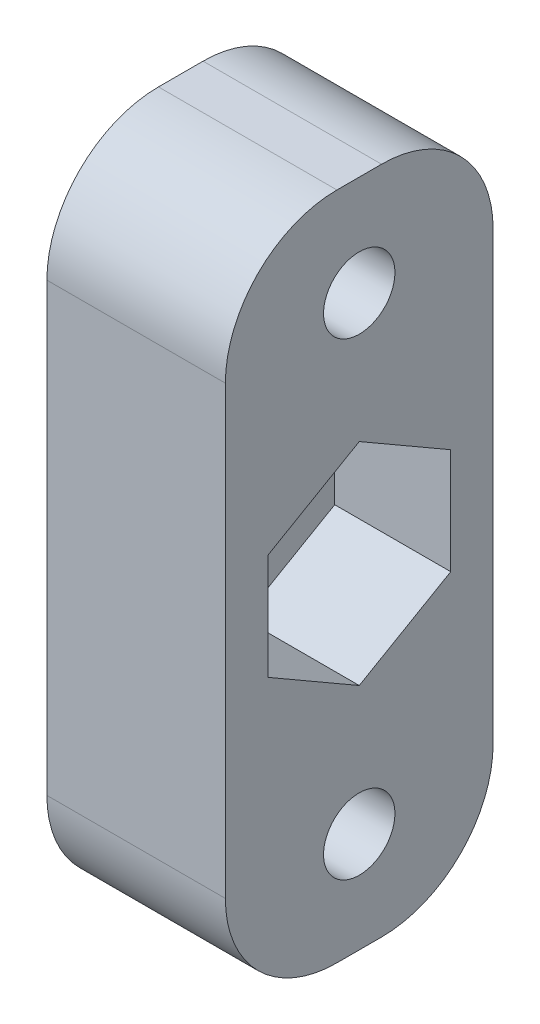
ISO-10303-21;
HEADER;
FILE_DESCRIPTION(('STEP AP214'),'2;1');
FILE_NAME('part.step','',(''),(''),'','','');
FILE_SCHEMA(('AUTOMOTIVE_DESIGN { 1 0 10303 214 1 1 1 1 }'));
ENDSEC;
DATA;
#1=APPLICATION_CONTEXT('core data for automotive mechanical design processes');
#2=APPLICATION_PROTOCOL_DEFINITION('international standard','automotive_design',2000,#1);
#3=PRODUCT_CONTEXT('',#1,'mechanical');
#4=PRODUCT('Part','Part','',(#3));
#5=PRODUCT_RELATED_PRODUCT_CATEGORY('part','',(#4));
#6=PRODUCT_DEFINITION_FORMATION('','',#4);
#7=PRODUCT_DEFINITION_CONTEXT('part definition',#1,'design');
#8=PRODUCT_DEFINITION('design','',#6,#7);
#9=PRODUCT_DEFINITION_SHAPE('','',#8);
#10=(LENGTH_UNIT() NAMED_UNIT(*) SI_UNIT(.MILLI.,.METRE.));
#11=(NAMED_UNIT(*) PLANE_ANGLE_UNIT() SI_UNIT($,.RADIAN.));
#12=(NAMED_UNIT(*) SI_UNIT($,.STERADIAN.) SOLID_ANGLE_UNIT());
#13=UNCERTAINTY_MEASURE_WITH_UNIT(LENGTH_MEASURE(1.E-05),#10,'distance_accuracy_value','');
#14=(GEOMETRIC_REPRESENTATION_CONTEXT(3) GLOBAL_UNCERTAINTY_ASSIGNED_CONTEXT((#13)) GLOBAL_UNIT_ASSIGNED_CONTEXT((#10,
#11,#12)) REPRESENTATION_CONTEXT('',''));
#15=CARTESIAN_POINT('',(0.,0.,0.));
#16=DIRECTION('',(0.,0.,1.));
#17=DIRECTION('',(1.,0.,0.));
#18=AXIS2_PLACEMENT_3D('',#15,#16,#17);
#19=CARTESIAN_POINT('',(-8.,-10.5,0.));
#20=DIRECTION('',(1.,0.,0.));
#21=DIRECTION('',(0.,0.,-1.));
#22=AXIS2_PLACEMENT_3D('',#19,#20,#21);
#23=CYLINDRICAL_SURFACE('',#22,1.6);
#24=CARTESIAN_POINT('',(0.,-10.5,0.));
#25=DIRECTION('',(1.,0.,0.));
#26=DIRECTION('',(0.,0.,-1.));
#27=AXIS2_PLACEMENT_3D('',#24,#25,#26);
#28=CIRCLE('',#27,1.6);
#29=CARTESIAN_POINT('',(0.,-10.5,-1.6));
#30=VERTEX_POINT('',#29);
#31=EDGE_CURVE('E270',#30,#30,#28,.T.);
#32=ORIENTED_EDGE('',*,*,#31,.T.);
#33=EDGE_LOOP('',(#32));
#34=FACE_BOUND('',#33,.T.);
#35=CARTESIAN_POINT('',(-2.8,-10.5,0.));
#36=DIRECTION('',(-1.,0.,0.));
#37=DIRECTION('',(0.,-1.,0.));
#38=AXIS2_PLACEMENT_3D('',#35,#36,#37);
#39=CIRCLE('',#38,1.6);
#40=CARTESIAN_POINT('',(-2.8,-12.1,0.));
#41=VERTEX_POINT('',#40);
#42=EDGE_CURVE('E258',#41,#41,#39,.F.);
#43=ORIENTED_EDGE('',*,*,#42,.F.);
#44=EDGE_LOOP('',(#43));
#45=FACE_BOUND('',#44,.T.);
#46=ADVANCED_FACE('F32',(#34,#45),#23,.F.);
#47=CARTESIAN_POINT('',(-7.99999999999999,15.,6.));
#48=DIRECTION('',(1.,0.,0.));
#49=DIRECTION('',(0.,1.,0.));
#50=AXIS2_PLACEMENT_3D('',#47,#48,#49);
#51=PLANE('',#50);
#52=DIRECTION('',(0.,0.5,0.866025403784439));
#53=VECTOR('',#52,1.);
#54=CARTESIAN_POINT('',(-8.,-3.99509618943233,16.9668238982516));
#55=LINE('',#54,#53);
#56=CARTESIAN_POINT('',(-8.,-13.7908965343809,0.));
#57=VERTEX_POINT('',#56);
#58=CARTESIAN_POINT('',(-8.,-12.1454482671904,2.85));
#59=VERTEX_POINT('',#58);
#60=EDGE_CURVE('E246',#57,#59,#55,.T.);
#61=ORIENTED_EDGE('',*,*,#60,.F.);
#62=DIRECTION('',(0.,-0.5,0.866025403784438));
#63=VECTOR('',#62,1.);
#64=CARTESIAN_POINT('',(-8.,-9.19124861213896,-7.9668238982516));
#65=LINE('',#64,#63);
#66=CARTESIAN_POINT('',(-8.,-12.1454482671904,-2.85));
#67=VERTEX_POINT('',#66);
#68=EDGE_CURVE('E213',#67,#57,#65,.T.);
#69=ORIENTED_EDGE('',*,*,#68,.F.);
#70=DIRECTION('',(0.,-1.,0.));
#71=VECTOR('',#70,1.);
#72=CARTESIAN_POINT('',(-7.99999999999999,15.,-2.85000000000001));
#73=LINE('',#72,#71);
#74=CARTESIAN_POINT('',(-8.,-8.85455173280957,-2.85));
#75=VERTEX_POINT('',#74);
#76=EDGE_CURVE('E232',#75,#67,#73,.T.);
#77=ORIENTED_EDGE('',*,*,#76,.F.);
#78=DIRECTION('',(0.,-0.5,-0.866025403784438));
#79=VECTOR('',#78,1.);
#80=CARTESIAN_POINT('',(-7.99999999999999,0.941248612138975,14.1168238982516));
#81=LINE('',#80,#79);
#82=CARTESIAN_POINT('',(-7.99999999999999,-7.20910346561913,0.));
#83=VERTEX_POINT('',#82);
#84=EDGE_CURVE('E235',#83,#75,#81,.T.);
#85=ORIENTED_EDGE('',*,*,#84,.F.);
#86=DIRECTION('',(0.,0.5,-0.866025403784439));
#87=VECTOR('',#86,1.);
#88=CARTESIAN_POINT('',(-8.,-4.25490381056767,-5.1168238982516));
#89=LINE('',#88,#87);
#90=CARTESIAN_POINT('',(-8.,-8.85455173280957,2.85));
#91=VERTEX_POINT('',#90);
#92=EDGE_CURVE('E251',#91,#83,#89,.T.);
#93=ORIENTED_EDGE('',*,*,#92,.F.);
#94=DIRECTION('',(0.,1.,0.));
#95=VECTOR('',#94,1.);
#96=CARTESIAN_POINT('',(-7.99999999999999,15.,2.85));
#97=LINE('',#96,#95);
#98=EDGE_CURVE('E248',#59,#91,#97,.T.);
#99=ORIENTED_EDGE('',*,*,#98,.F.);
#100=EDGE_LOOP('',(#61,#69,#77,#85,#93,#99));
#101=FACE_BOUND('',#100,.T.);
#102=CARTESIAN_POINT('',(-8.,0.,0.));
#103=DIRECTION('',(1.,0.,0.));
#104=DIRECTION('',(0.,0.,-1.));
#105=AXIS2_PLACEMENT_3D('',#102,#103,#104);
#106=CIRCLE('',#105,2.6);
#107=CARTESIAN_POINT('',(-8.,0.,-2.6));
#108=VERTEX_POINT('',#107);
#109=EDGE_CURVE('E266',#108,#108,#106,.T.);
#110=ORIENTED_EDGE('',*,*,#109,.T.);
#111=EDGE_LOOP('',(#110));
#112=FACE_BOUND('',#111,.T.);
#113=DIRECTION('',(0.,-1.,0.));
#114=VECTOR('',#113,1.);
#115=CARTESIAN_POINT('',(-7.99999999999999,15.,6.));
#116=LINE('',#115,#114);
#117=CARTESIAN_POINT('',(-7.99999999999999,10.,6.));
#118=VERTEX_POINT('',#117);
#119=CARTESIAN_POINT('',(-8.,-10.,6.));
#120=VERTEX_POINT('',#119);
#121=EDGE_CURVE('E374',#118,#120,#116,.T.);
#122=ORIENTED_EDGE('',*,*,#121,.F.);
#123=CARTESIAN_POINT('',(-7.99999999999999,10.,1.));
#124=DIRECTION('',(1.,0.,0.));
#125=DIRECTION('',(0.,1.,0.));
#126=AXIS2_PLACEMENT_3D('',#123,#124,#125);
#127=CIRCLE('',#126,5.);
#128=CARTESIAN_POINT('',(-7.99999999999999,15.,1.));
#129=VERTEX_POINT('',#128);
#130=EDGE_CURVE('E411',#118,#129,#127,.F.);
#131=ORIENTED_EDGE('',*,*,#130,.T.);
#132=DIRECTION('',(0.,0.,-1.));
#133=VECTOR('',#132,1.);
#134=CARTESIAN_POINT('',(-7.99999999999999,15.,6.));
#135=LINE('',#134,#133);
#136=CARTESIAN_POINT('',(-7.99999999999999,15.,-1.));
#137=VERTEX_POINT('',#136);
#138=EDGE_CURVE('E387',#129,#137,#135,.T.);
#139=ORIENTED_EDGE('',*,*,#138,.T.);
#140=CARTESIAN_POINT('',(-7.99999999999999,10.,-1.));
#141=DIRECTION('',(1.,0.,0.));
#142=DIRECTION('',(0.,1.,0.));
#143=AXIS2_PLACEMENT_3D('',#140,#141,#142);
#144=CIRCLE('',#143,5.);
#145=CARTESIAN_POINT('',(-7.99999999999999,10.,-6.));
#146=VERTEX_POINT('',#145);
#147=EDGE_CURVE('E409',#137,#146,#144,.F.);
#148=ORIENTED_EDGE('',*,*,#147,.T.);
#149=DIRECTION('',(0.,-1.,0.));
#150=VECTOR('',#149,1.);
#151=CARTESIAN_POINT('',(-7.99999999999999,15.,-6.));
#152=LINE('',#151,#150);
#153=CARTESIAN_POINT('',(-8.,-10.,-6.));
#154=VERTEX_POINT('',#153);
#155=EDGE_CURVE('E375',#146,#154,#152,.T.);
#156=ORIENTED_EDGE('',*,*,#155,.T.);
#157=CARTESIAN_POINT('',(-8.,-10.,-1.));
#158=DIRECTION('',(1.,0.,0.));
#159=DIRECTION('',(0.,1.,0.));
#160=AXIS2_PLACEMENT_3D('',#157,#158,#159);
#161=CIRCLE('',#160,5.);
#162=CARTESIAN_POINT('',(-8.,-15.,-1.));
#163=VERTEX_POINT('',#162);
#164=EDGE_CURVE('E405',#154,#163,#161,.F.);
#165=ORIENTED_EDGE('',*,*,#164,.T.);
#166=DIRECTION('',(0.,0.,-1.));
#167=VECTOR('',#166,1.);
#168=CARTESIAN_POINT('',(-8.,-15.,6.));
#169=LINE('',#168,#167);
#170=CARTESIAN_POINT('',(-8.,-15.,1.));
#171=VERTEX_POINT('',#170);
#172=EDGE_CURVE('E384',#171,#163,#169,.T.);
#173=ORIENTED_EDGE('',*,*,#172,.F.);
#174=CARTESIAN_POINT('',(-8.,-10.,1.));
#175=DIRECTION('',(1.,0.,0.));
#176=DIRECTION('',(0.,1.,0.));
#177=AXIS2_PLACEMENT_3D('',#174,#175,#176);
#178=CIRCLE('',#177,5.);
#179=EDGE_CURVE('E407',#171,#120,#178,.F.);
#180=ORIENTED_EDGE('',*,*,#179,.T.);
#181=EDGE_LOOP('',(#122,#131,#139,#148,#156,#165,#173,#180));
#182=FACE_BOUND('',#181,.T.);
#183=DIRECTION('',(0.,0.5,-0.866025403784438));
#184=VECTOR('',#183,1.);
#185=CARTESIAN_POINT('',(-7.99999999999999,6.55875138786103,1.12644284148501));
#186=LINE('',#185,#184);
#187=CARTESIAN_POINT('',(-7.99999999999999,7.20910346561913,0.));
#188=VERTEX_POINT('',#187);
#189=CARTESIAN_POINT('',(-7.99999999999999,8.85455173280956,-2.85));
#190=VERTEX_POINT('',#189);
#191=EDGE_CURVE('E292',#188,#190,#186,.T.);
#192=ORIENTED_EDGE('',*,*,#191,.T.);
#193=DIRECTION('',(0.,1.,0.));
#194=VECTOR('',#193,1.);
#195=CARTESIAN_POINT('',(-7.99999999999999,15.,-2.85));
#196=LINE('',#195,#194);
#197=CARTESIAN_POINT('',(-7.99999999999999,12.1454482671904,-2.85));
#198=VERTEX_POINT('',#197);
#199=EDGE_CURVE('E295',#190,#198,#196,.T.);
#200=ORIENTED_EDGE('',*,*,#199,.T.);
#201=DIRECTION('',(0.,0.5,0.866025403784438));
#202=VECTOR('',#201,1.);
#203=CARTESIAN_POINT('',(-7.99999999999999,16.691248612139,5.02355715851498));
#204=LINE('',#203,#202);
#205=CARTESIAN_POINT('',(-7.99999999999999,13.7908965343809,0.));
#206=VERTEX_POINT('',#205);
#207=EDGE_CURVE('E298',#198,#206,#204,.T.);
#208=ORIENTED_EDGE('',*,*,#207,.T.);
#209=DIRECTION('',(0.,-0.5,0.866025403784439));
#210=VECTOR('',#209,1.);
#211=CARTESIAN_POINT('',(-7.99999999999999,11.4950961894323,3.97644284148501));
#212=LINE('',#211,#210);
#213=CARTESIAN_POINT('',(-7.99999999999999,12.1454482671904,2.85));
#214=VERTEX_POINT('',#213);
#215=EDGE_CURVE('E301',#206,#214,#212,.T.);
#216=ORIENTED_EDGE('',*,*,#215,.T.);
#217=DIRECTION('',(0.,-1.,0.));
#218=VECTOR('',#217,1.);
#219=CARTESIAN_POINT('',(-7.99999999999999,15.,2.85));
#220=LINE('',#219,#218);
#221=CARTESIAN_POINT('',(-7.99999999999999,8.85455173280957,2.85));
#222=VERTEX_POINT('',#221);
#223=EDGE_CURVE('E304',#214,#222,#220,.T.);
#224=ORIENTED_EDGE('',*,*,#223,.T.);
#225=DIRECTION('',(0.,-0.5,-0.866025403784439));
#226=VECTOR('',#225,1.);
#227=CARTESIAN_POINT('',(-7.99999999999999,11.7549038105677,7.87355715851499));
#228=LINE('',#227,#226);
#229=EDGE_CURVE('E281',#222,#188,#228,.T.);
#230=ORIENTED_EDGE('',*,*,#229,.T.);
#231=EDGE_LOOP('',(#192,#200,#208,#216,#224,#230));
#232=FACE_BOUND('',#231,.T.);
#233=ADVANCED_FACE('F442',(#101,#112,#182,#232),#51,.F.);
#234=CARTESIAN_POINT('',(0.,15.,6.));
#235=DIRECTION('',(-1.,0.,0.));
#236=DIRECTION('',(0.,0.,1.));
#237=AXIS2_PLACEMENT_3D('',#234,#235,#236);
#238=PLANE('',#237);
#239=ORIENTED_EDGE('',*,*,#31,.F.);
#240=EDGE_LOOP('',(#239));
#241=FACE_BOUND('',#240,.T.);
#242=CARTESIAN_POINT('',(0.,10.5,0.));
#243=DIRECTION('',(1.,0.,0.));
#244=DIRECTION('',(0.,0.,-1.));
#245=AXIS2_PLACEMENT_3D('',#242,#243,#244);
#246=CIRCLE('',#245,1.6);
#247=CARTESIAN_POINT('',(0.,10.5,-1.6));
#248=VERTEX_POINT('',#247);
#249=EDGE_CURVE('E273',#248,#248,#246,.T.);
#250=ORIENTED_EDGE('',*,*,#249,.F.);
#251=EDGE_LOOP('',(#250));
#252=FACE_BOUND('',#251,.T.);
#253=DIRECTION('',(0.,-0.5,0.866025403784439));
#254=VECTOR('',#253,1.);
#255=CARTESIAN_POINT('',(0.,4.73427220735493,0.));
#256=LINE('',#255,#254);
#257=CARTESIAN_POINT('',(0.,4.73427220735493,0.));
#258=VERTEX_POINT('',#257);
#259=CARTESIAN_POINT('',(0.,2.36713610367747,4.1));
#260=VERTEX_POINT('',#259);
#261=EDGE_CURVE('E344',#258,#260,#256,.T.);
#262=ORIENTED_EDGE('',*,*,#261,.F.);
#263=DIRECTION('',(0.,0.5,0.866025403784439));
#264=VECTOR('',#263,1.);
#265=CARTESIAN_POINT('',(0.,2.36713610367747,-4.1));
#266=LINE('',#265,#264);
#267=CARTESIAN_POINT('',(0.,2.36713610367747,-4.1));
#268=VERTEX_POINT('',#267);
#269=EDGE_CURVE('E322',#268,#258,#266,.T.);
#270=ORIENTED_EDGE('',*,*,#269,.F.);
#271=DIRECTION('',(0.,1.,0.));
#272=VECTOR('',#271,1.);
#273=CARTESIAN_POINT('',(0.,-2.36713610367747,-4.1));
#274=LINE('',#273,#272);
#275=CARTESIAN_POINT('',(0.,-2.36713610367747,-4.1));
#276=VERTEX_POINT('',#275);
#277=EDGE_CURVE('E327',#276,#268,#274,.T.);
#278=ORIENTED_EDGE('',*,*,#277,.F.);
#279=DIRECTION('',(0.,0.5,-0.866025403784439));
#280=VECTOR('',#279,1.);
#281=CARTESIAN_POINT('',(0.,-4.73427220735493,0.));
#282=LINE('',#281,#280);
#283=CARTESIAN_POINT('',(0.,-4.73427220735493,0.));
#284=VERTEX_POINT('',#283);
#285=EDGE_CURVE('E353',#284,#276,#282,.T.);
#286=ORIENTED_EDGE('',*,*,#285,.F.);
#287=DIRECTION('',(0.,-0.5,-0.866025403784439));
#288=VECTOR('',#287,1.);
#289=CARTESIAN_POINT('',(0.,-2.36713610367747,4.1));
#290=LINE('',#289,#288);
#291=CARTESIAN_POINT('',(0.,-2.36713610367747,4.1));
#292=VERTEX_POINT('',#291);
#293=EDGE_CURVE('E350',#292,#284,#290,.T.);
#294=ORIENTED_EDGE('',*,*,#293,.F.);
#295=DIRECTION('',(0.,-1.,0.));
#296=VECTOR('',#295,1.);
#297=CARTESIAN_POINT('',(0.,2.36713610367747,4.1));
#298=LINE('',#297,#296);
#299=EDGE_CURVE('E347',#260,#292,#298,.T.);
#300=ORIENTED_EDGE('',*,*,#299,.F.);
#301=EDGE_LOOP('',(#262,#270,#278,#286,#294,#300));
#302=FACE_BOUND('',#301,.T.);
#303=DIRECTION('',(0.,0.,-1.));
#304=VECTOR('',#303,1.);
#305=CARTESIAN_POINT('',(0.,15.,6.));
#306=LINE('',#305,#304);
#307=CARTESIAN_POINT('',(0.,15.,1.));
#308=VERTEX_POINT('',#307);
#309=CARTESIAN_POINT('',(0.,15.,-1.));
#310=VERTEX_POINT('',#309);
#311=EDGE_CURVE('E390',#308,#310,#306,.T.);
#312=ORIENTED_EDGE('',*,*,#311,.F.);
#313=CARTESIAN_POINT('',(0.,10.,1.));
#314=DIRECTION('',(-1.,0.,0.));
#315=DIRECTION('',(0.,0.,1.));
#316=AXIS2_PLACEMENT_3D('',#313,#314,#315);
#317=CIRCLE('',#316,5.);
#318=CARTESIAN_POINT('',(0.,10.,6.));
#319=VERTEX_POINT('',#318);
#320=EDGE_CURVE('E422',#308,#319,#317,.F.);
#321=ORIENTED_EDGE('',*,*,#320,.T.);
#322=DIRECTION('',(0.,1.,0.));
#323=VECTOR('',#322,1.);
#324=CARTESIAN_POINT('',(0.,15.,6.));
#325=LINE('',#324,#323);
#326=CARTESIAN_POINT('',(0.,-10.,6.));
#327=VERTEX_POINT('',#326);
#328=EDGE_CURVE('E371',#327,#319,#325,.T.);
#329=ORIENTED_EDGE('',*,*,#328,.F.);
#330=CARTESIAN_POINT('',(0.,-10.,1.));
#331=DIRECTION('',(-1.,0.,0.));
#332=DIRECTION('',(0.,0.,1.));
#333=AXIS2_PLACEMENT_3D('',#330,#331,#332);
#334=CIRCLE('',#333,5.);
#335=CARTESIAN_POINT('',(0.,-15.,1.));
#336=VERTEX_POINT('',#335);
#337=EDGE_CURVE('E55',#327,#336,#334,.F.);
#338=ORIENTED_EDGE('',*,*,#337,.T.);
#339=DIRECTION('',(0.,0.,-1.));
#340=VECTOR('',#339,1.);
#341=CARTESIAN_POINT('',(0.,-15.,6.));
#342=LINE('',#341,#340);
#343=CARTESIAN_POINT('',(0.,-15.,-1.));
#344=VERTEX_POINT('',#343);
#345=EDGE_CURVE('E378',#336,#344,#342,.T.);
#346=ORIENTED_EDGE('',*,*,#345,.T.);
#347=CARTESIAN_POINT('',(0.,-10.,-1.));
#348=DIRECTION('',(-1.,0.,0.));
#349=DIRECTION('',(0.,0.,1.));
#350=AXIS2_PLACEMENT_3D('',#347,#348,#349);
#351=CIRCLE('',#350,5.);
#352=CARTESIAN_POINT('',(0.,-10.,-6.));
#353=VERTEX_POINT('',#352);
#354=EDGE_CURVE('E47',#344,#353,#351,.F.);
#355=ORIENTED_EDGE('',*,*,#354,.T.);
#356=DIRECTION('',(0.,1.,0.));
#357=VECTOR('',#356,1.);
#358=CARTESIAN_POINT('',(0.,15.,-6.));
#359=LINE('',#358,#357);
#360=CARTESIAN_POINT('',(0.,10.,-6.));
#361=VERTEX_POINT('',#360);
#362=EDGE_CURVE('E360',#353,#361,#359,.T.);
#363=ORIENTED_EDGE('',*,*,#362,.T.);
#364=CARTESIAN_POINT('',(0.,10.,-1.));
#365=DIRECTION('',(-1.,0.,0.));
#366=DIRECTION('',(0.,0.,1.));
#367=AXIS2_PLACEMENT_3D('',#364,#365,#366);
#368=CIRCLE('',#367,5.);
#369=EDGE_CURVE('E420',#361,#310,#368,.F.);
#370=ORIENTED_EDGE('',*,*,#369,.T.);
#371=EDGE_LOOP('',(#312,#321,#329,#338,#346,#355,#363,#370));
#372=FACE_BOUND('',#371,.T.);
#373=ADVANCED_FACE('F433',(#241,#252,#302,#372),#238,.F.);
#374=CARTESIAN_POINT('',(-7.99999999999999,15.,6.));
#375=DIRECTION('',(0.,-1.,0.));
#376=DIRECTION('',(0.,0.,-1.));
#377=AXIS2_PLACEMENT_3D('',#374,#375,#376);
#378=PLANE('',#377);
#379=ORIENTED_EDGE('',*,*,#138,.F.);
#380=DIRECTION('',(-1.,0.,0.));
#381=VECTOR('',#380,1.);
#382=CARTESIAN_POINT('',(0.,15.,1.));
#383=LINE('',#382,#381);
#384=EDGE_CURVE('E416',#129,#308,#383,.F.);
#385=ORIENTED_EDGE('',*,*,#384,.T.);
#386=ORIENTED_EDGE('',*,*,#311,.T.);
#387=DIRECTION('',(-1.,0.,0.));
#388=VECTOR('',#387,1.);
#389=CARTESIAN_POINT('',(-7.99999999999999,15.,-1.));
#390=LINE('',#389,#388);
#391=EDGE_CURVE('E413',#310,#137,#390,.T.);
#392=ORIENTED_EDGE('',*,*,#391,.T.);
#393=EDGE_LOOP('',(#379,#385,#386,#392));
#394=FACE_BOUND('',#393,.T.);
#395=ADVANCED_FACE('F451',(#394),#378,.F.);
#396=CARTESIAN_POINT('',(-8.,-15.,6.));
#397=DIRECTION('',(0.,1.,0.));
#398=DIRECTION('',(0.,0.,1.));
#399=AXIS2_PLACEMENT_3D('',#396,#397,#398);
#400=PLANE('',#399);
#401=ORIENTED_EDGE('',*,*,#345,.F.);
#402=DIRECTION('',(1.,0.,0.));
#403=VECTOR('',#402,1.);
#404=CARTESIAN_POINT('',(-8.,-15.,1.));
#405=LINE('',#404,#403);
#406=EDGE_CURVE('E11',#336,#171,#405,.F.);
#407=ORIENTED_EDGE('',*,*,#406,.T.);
#408=ORIENTED_EDGE('',*,*,#172,.T.);
#409=DIRECTION('',(1.,0.,0.));
#410=VECTOR('',#409,1.);
#411=CARTESIAN_POINT('',(-8.,-15.,-1.));
#412=LINE('',#411,#410);
#413=EDGE_CURVE('E40',#163,#344,#412,.T.);
#414=ORIENTED_EDGE('',*,*,#413,.T.);
#415=EDGE_LOOP('',(#401,#407,#408,#414));
#416=FACE_BOUND('',#415,.T.);
#417=ADVANCED_FACE('F428',(#416),#400,.F.);
#418=CARTESIAN_POINT('',(0.,-15.,6.));
#419=DIRECTION('',(0.,0.,1.));
#420=DIRECTION('',(1.,0.,0.));
#421=AXIS2_PLACEMENT_3D('',#418,#419,#420);
#422=PLANE('',#421);
#423=ORIENTED_EDGE('',*,*,#328,.T.);
#424=DIRECTION('',(-1.,0.,0.));
#425=VECTOR('',#424,1.);
#426=CARTESIAN_POINT('',(-7.99999999999999,10.,6.));
#427=LINE('',#426,#425);
#428=EDGE_CURVE('E402',#319,#118,#427,.T.);
#429=ORIENTED_EDGE('',*,*,#428,.T.);
#430=ORIENTED_EDGE('',*,*,#121,.T.);
#431=DIRECTION('',(1.,0.,0.));
#432=VECTOR('',#431,1.);
#433=CARTESIAN_POINT('',(0.,-10.,6.));
#434=LINE('',#433,#432);
#435=EDGE_CURVE('E393',#120,#327,#434,.T.);
#436=ORIENTED_EDGE('',*,*,#435,.T.);
#437=EDGE_LOOP('',(#423,#429,#430,#436));
#438=FACE_BOUND('',#437,.T.);
#439=ADVANCED_FACE('F457',(#438),#422,.T.);
#440=CARTESIAN_POINT('',(0.,-15.,-6.));
#441=DIRECTION('',(0.,0.,1.));
#442=DIRECTION('',(1.,0.,0.));
#443=AXIS2_PLACEMENT_3D('',#440,#441,#442);
#444=PLANE('',#443);
#445=ORIENTED_EDGE('',*,*,#155,.F.);
#446=DIRECTION('',(-1.,0.,0.));
#447=VECTOR('',#446,1.);
#448=CARTESIAN_POINT('',(0.,10.,-6.));
#449=LINE('',#448,#447);
#450=EDGE_CURVE('E426',#146,#361,#449,.F.);
#451=ORIENTED_EDGE('',*,*,#450,.T.);
#452=ORIENTED_EDGE('',*,*,#362,.F.);
#453=DIRECTION('',(1.,0.,0.));
#454=VECTOR('',#453,1.);
#455=CARTESIAN_POINT('',(0.,-10.,-6.));
#456=LINE('',#455,#454);
#457=EDGE_CURVE('E424',#353,#154,#456,.F.);
#458=ORIENTED_EDGE('',*,*,#457,.T.);
#459=EDGE_LOOP('',(#445,#451,#452,#458));
#460=FACE_BOUND('',#459,.T.);
#461=ADVANCED_FACE('F438',(#460),#444,.F.);
#462=CARTESIAN_POINT('',(-5.2,2.36713610367747,-4.1));
#463=DIRECTION('',(0.,0.866025403784439,-0.5));
#464=DIRECTION('',(0.,0.5,0.866025403784439));
#465=AXIS2_PLACEMENT_3D('',#462,#463,#464);
#466=PLANE('',#465);
#467=ORIENTED_EDGE('',*,*,#269,.T.);
#468=DIRECTION('',(1.,0.,0.));
#469=VECTOR('',#468,1.);
#470=CARTESIAN_POINT('',(-5.2,4.73427220735493,0.));
#471=LINE('',#470,#469);
#472=CARTESIAN_POINT('',(-5.2,4.73427220735493,0.));
#473=VERTEX_POINT('',#472);
#474=EDGE_CURVE('E342',#473,#258,#471,.T.);
#475=ORIENTED_EDGE('',*,*,#474,.F.);
#476=DIRECTION('',(0.,0.5,0.866025403784439));
#477=VECTOR('',#476,1.);
#478=CARTESIAN_POINT('',(-5.2,2.36713610367747,-4.1));
#479=LINE('',#478,#477);
#480=CARTESIAN_POINT('',(-5.2,2.36713610367747,-4.1));
#481=VERTEX_POINT('',#480);
#482=EDGE_CURVE('E323',#481,#473,#479,.T.);
#483=ORIENTED_EDGE('',*,*,#482,.F.);
#484=DIRECTION('',(1.,0.,0.));
#485=VECTOR('',#484,1.);
#486=CARTESIAN_POINT('',(-5.2,2.36713610367747,-4.1));
#487=LINE('',#486,#485);
#488=EDGE_CURVE('E358',#481,#268,#487,.T.);
#489=ORIENTED_EDGE('',*,*,#488,.T.);
#490=EDGE_LOOP('',(#467,#475,#483,#489));
#491=FACE_BOUND('',#490,.T.);
#492=ADVANCED_FACE('F521',(#491),#466,.F.);
#493=CARTESIAN_POINT('',(-5.2,-2.36713610367747,-4.1));
#494=DIRECTION('',(0.,0.,-1.));
#495=DIRECTION('',(-1.,0.,0.));
#496=AXIS2_PLACEMENT_3D('',#493,#494,#495);
#497=PLANE('',#496);
#498=ORIENTED_EDGE('',*,*,#277,.T.);
#499=ORIENTED_EDGE('',*,*,#488,.F.);
#500=DIRECTION('',(0.,1.,0.));
#501=VECTOR('',#500,1.);
#502=CARTESIAN_POINT('',(-5.2,-2.36713610367747,-4.1));
#503=LINE('',#502,#501);
#504=CARTESIAN_POINT('',(-5.2,-2.36713610367747,-4.1));
#505=VERTEX_POINT('',#504);
#506=EDGE_CURVE('E339',#505,#481,#503,.T.);
#507=ORIENTED_EDGE('',*,*,#506,.F.);
#508=DIRECTION('',(1.,0.,0.));
#509=VECTOR('',#508,1.);
#510=CARTESIAN_POINT('',(-5.2,-2.36713610367747,-4.1));
#511=LINE('',#510,#509);
#512=EDGE_CURVE('E361',#505,#276,#511,.T.);
#513=ORIENTED_EDGE('',*,*,#512,.T.);
#514=EDGE_LOOP('',(#498,#499,#507,#513));
#515=FACE_BOUND('',#514,.T.);
#516=ADVANCED_FACE('F517',(#515),#497,.F.);
#517=CARTESIAN_POINT('',(-5.2,-4.73427220735493,0.));
#518=DIRECTION('',(0.,-0.866025403784439,-0.5));
#519=DIRECTION('',(0.,0.5,-0.866025403784439));
#520=AXIS2_PLACEMENT_3D('',#517,#518,#519);
#521=PLANE('',#520);
#522=ORIENTED_EDGE('',*,*,#285,.T.);
#523=ORIENTED_EDGE('',*,*,#512,.F.);
#524=DIRECTION('',(0.,0.5,-0.866025403784439));
#525=VECTOR('',#524,1.);
#526=CARTESIAN_POINT('',(-5.2,-4.73427220735493,0.));
#527=LINE('',#526,#525);
#528=CARTESIAN_POINT('',(-5.2,-4.73427220735493,0.));
#529=VERTEX_POINT('',#528);
#530=EDGE_CURVE('E336',#529,#505,#527,.T.);
#531=ORIENTED_EDGE('',*,*,#530,.F.);
#532=DIRECTION('',(1.,0.,0.));
#533=VECTOR('',#532,1.);
#534=CARTESIAN_POINT('',(-5.2,-4.73427220735493,0.));
#535=LINE('',#534,#533);
#536=EDGE_CURVE('E363',#529,#284,#535,.T.);
#537=ORIENTED_EDGE('',*,*,#536,.T.);
#538=EDGE_LOOP('',(#522,#523,#531,#537));
#539=FACE_BOUND('',#538,.T.);
#540=ADVANCED_FACE('F520',(#539),#521,.F.);
#541=CARTESIAN_POINT('',(-5.2,-2.36713610367747,4.1));
#542=DIRECTION('',(0.,-0.866025403784439,0.5));
#543=DIRECTION('',(0.,-0.5,-0.866025403784439));
#544=AXIS2_PLACEMENT_3D('',#541,#542,#543);
#545=PLANE('',#544);
#546=ORIENTED_EDGE('',*,*,#293,.T.);
#547=ORIENTED_EDGE('',*,*,#536,.F.);
#548=DIRECTION('',(0.,-0.5,-0.866025403784439));
#549=VECTOR('',#548,1.);
#550=CARTESIAN_POINT('',(-5.2,-2.36713610367747,4.1));
#551=LINE('',#550,#549);
#552=CARTESIAN_POINT('',(-5.2,-2.36713610367747,4.1));
#553=VERTEX_POINT('',#552);
#554=EDGE_CURVE('E333',#553,#529,#551,.T.);
#555=ORIENTED_EDGE('',*,*,#554,.F.);
#556=DIRECTION('',(1.,0.,0.));
#557=VECTOR('',#556,1.);
#558=CARTESIAN_POINT('',(-5.2,-2.36713610367747,4.1));
#559=LINE('',#558,#557);
#560=EDGE_CURVE('E365',#553,#292,#559,.T.);
#561=ORIENTED_EDGE('',*,*,#560,.T.);
#562=EDGE_LOOP('',(#546,#547,#555,#561));
#563=FACE_BOUND('',#562,.T.);
#564=ADVANCED_FACE('F525',(#563),#545,.F.);
#565=CARTESIAN_POINT('',(-5.2,2.36713610367747,4.1));
#566=DIRECTION('',(0.,0.,1.));
#567=DIRECTION('',(0.,-1.,0.));
#568=AXIS2_PLACEMENT_3D('',#565,#566,#567);
#569=PLANE('',#568);
#570=ORIENTED_EDGE('',*,*,#299,.T.);
#571=ORIENTED_EDGE('',*,*,#560,.F.);
#572=DIRECTION('',(0.,-1.,0.));
#573=VECTOR('',#572,1.);
#574=CARTESIAN_POINT('',(-5.2,2.36713610367747,4.1));
#575=LINE('',#574,#573);
#576=CARTESIAN_POINT('',(-5.2,2.36713610367747,4.1));
#577=VERTEX_POINT('',#576);
#578=EDGE_CURVE('E330',#577,#553,#575,.T.);
#579=ORIENTED_EDGE('',*,*,#578,.F.);
#580=DIRECTION('',(1.,0.,0.));
#581=VECTOR('',#580,1.);
#582=CARTESIAN_POINT('',(-5.2,2.36713610367747,4.1));
#583=LINE('',#582,#581);
#584=EDGE_CURVE('E367',#577,#260,#583,.T.);
#585=ORIENTED_EDGE('',*,*,#584,.T.);
#586=EDGE_LOOP('',(#570,#571,#579,#585));
#587=FACE_BOUND('',#586,.T.);
#588=ADVANCED_FACE('F529',(#587),#569,.F.);
#589=CARTESIAN_POINT('',(-5.2,4.73427220735493,0.));
#590=DIRECTION('',(0.,0.866025403784439,0.5));
#591=DIRECTION('',(0.,-0.5,0.866025403784439));
#592=AXIS2_PLACEMENT_3D('',#589,#590,#591);
#593=PLANE('',#592);
#594=ORIENTED_EDGE('',*,*,#261,.T.);
#595=ORIENTED_EDGE('',*,*,#584,.F.);
#596=DIRECTION('',(0.,-0.5,0.866025403784439));
#597=VECTOR('',#596,1.);
#598=CARTESIAN_POINT('',(-5.2,4.73427220735493,0.));
#599=LINE('',#598,#597);
#600=EDGE_CURVE('E326',#473,#577,#599,.T.);
#601=ORIENTED_EDGE('',*,*,#600,.F.);
#602=ORIENTED_EDGE('',*,*,#474,.T.);
#603=EDGE_LOOP('',(#594,#595,#601,#602));
#604=FACE_BOUND('',#603,.T.);
#605=ADVANCED_FACE('F515',(#604),#593,.F.);
#606=CARTESIAN_POINT('',(-5.2,4.73427220735493,0.));
#607=DIRECTION('',(1.,0.,0.));
#608=DIRECTION('',(0.,0.,-1.));
#609=AXIS2_PLACEMENT_3D('',#606,#607,#608);
#610=PLANE('',#609);
#611=CARTESIAN_POINT('',(-5.2,0.,0.));
#612=DIRECTION('',(1.,0.,0.));
#613=DIRECTION('',(0.,0.,-1.));
#614=AXIS2_PLACEMENT_3D('',#611,#612,#613);
#615=CIRCLE('',#614,2.6);
#616=CARTESIAN_POINT('',(-5.2,0.,-2.6));
#617=VERTEX_POINT('',#616);
#618=EDGE_CURVE('E269',#617,#617,#615,.T.);
#619=ORIENTED_EDGE('',*,*,#618,.F.);
#620=EDGE_LOOP('',(#619));
#621=FACE_BOUND('',#620,.T.);
#622=ORIENTED_EDGE('',*,*,#482,.T.);
#623=ORIENTED_EDGE('',*,*,#600,.T.);
#624=ORIENTED_EDGE('',*,*,#578,.T.);
#625=ORIENTED_EDGE('',*,*,#554,.T.);
#626=ORIENTED_EDGE('',*,*,#530,.T.);
#627=ORIENTED_EDGE('',*,*,#506,.T.);
#628=EDGE_LOOP('',(#622,#623,#624,#625,#626,#627));
#629=FACE_BOUND('',#628,.T.);
#630=ADVANCED_FACE('F511',(#621,#629),#610,.T.);
#631=CARTESIAN_POINT('',(-2.8,6.55875138786103,1.12644284148501));
#632=DIRECTION('',(0.,0.866025403784438,0.5));
#633=DIRECTION('',(0.,-0.5,0.866025403784438));
#634=AXIS2_PLACEMENT_3D('',#631,#632,#633);
#635=PLANE('',#634);
#636=ORIENTED_EDGE('',*,*,#191,.F.);
#637=DIRECTION('',(-1.,0.,0.));
#638=VECTOR('',#637,1.);
#639=CARTESIAN_POINT('',(-2.8,7.20910346561913,0.));
#640=LINE('',#639,#638);
#641=CARTESIAN_POINT('',(-2.8,7.20910346561913,0.));
#642=VERTEX_POINT('',#641);
#643=EDGE_CURVE('E291',#642,#188,#640,.T.);
#644=ORIENTED_EDGE('',*,*,#643,.F.);
#645=DIRECTION('',(0.,0.5,-0.866025403784438));
#646=VECTOR('',#645,1.);
#647=CARTESIAN_POINT('',(-2.8,6.55875138786103,1.12644284148501));
#648=LINE('',#647,#646);
#649=CARTESIAN_POINT('',(-2.8,8.85455173280956,-2.85));
#650=VERTEX_POINT('',#649);
#651=EDGE_CURVE('E277',#642,#650,#648,.T.);
#652=ORIENTED_EDGE('',*,*,#651,.T.);
#653=DIRECTION('',(-1.,0.,0.));
#654=VECTOR('',#653,1.);
#655=CARTESIAN_POINT('',(-2.8,8.85455173280956,-2.85));
#656=LINE('',#655,#654);
#657=EDGE_CURVE('E319',#650,#190,#656,.T.);
#658=ORIENTED_EDGE('',*,*,#657,.T.);
#659=EDGE_LOOP('',(#636,#644,#652,#658));
#660=FACE_BOUND('',#659,.T.);
#661=ADVANCED_FACE('F507',(#660),#635,.T.);
#662=CARTESIAN_POINT('',(-2.8,15.,-2.85));
#663=DIRECTION('',(0.,0.,1.));
#664=DIRECTION('',(0.,-1.,0.));
#665=AXIS2_PLACEMENT_3D('',#662,#663,#664);
#666=PLANE('',#665);
#667=ORIENTED_EDGE('',*,*,#199,.F.);
#668=ORIENTED_EDGE('',*,*,#657,.F.);
#669=DIRECTION('',(0.,1.,0.));
#670=VECTOR('',#669,1.);
#671=CARTESIAN_POINT('',(-2.8,15.,-2.85));
#672=LINE('',#671,#670);
#673=CARTESIAN_POINT('',(-2.8,12.1454482671904,-2.85));
#674=VERTEX_POINT('',#673);
#675=EDGE_CURVE('E280',#650,#674,#672,.T.);
#676=ORIENTED_EDGE('',*,*,#675,.T.);
#677=DIRECTION('',(-1.,0.,0.));
#678=VECTOR('',#677,1.);
#679=CARTESIAN_POINT('',(-2.8,12.1454482671904,-2.85));
#680=LINE('',#679,#678);
#681=EDGE_CURVE('E317',#674,#198,#680,.T.);
#682=ORIENTED_EDGE('',*,*,#681,.T.);
#683=EDGE_LOOP('',(#667,#668,#676,#682));
#684=FACE_BOUND('',#683,.T.);
#685=ADVANCED_FACE('F503',(#684),#666,.T.);
#686=CARTESIAN_POINT('',(-2.8,16.691248612139,5.02355715851498));
#687=DIRECTION('',(0.,-0.866025403784438,0.5));
#688=DIRECTION('',(0.,-0.5,-0.866025403784438));
#689=AXIS2_PLACEMENT_3D('',#686,#687,#688);
#690=PLANE('',#689);
#691=ORIENTED_EDGE('',*,*,#207,.F.);
#692=ORIENTED_EDGE('',*,*,#681,.F.);
#693=DIRECTION('',(0.,0.5,0.866025403784438));
#694=VECTOR('',#693,1.);
#695=CARTESIAN_POINT('',(-2.8,16.691248612139,5.02355715851498));
#696=LINE('',#695,#694);
#697=CARTESIAN_POINT('',(-2.8,13.7908965343809,0.));
#698=VERTEX_POINT('',#697);
#699=EDGE_CURVE('E283',#674,#698,#696,.T.);
#700=ORIENTED_EDGE('',*,*,#699,.T.);
#701=DIRECTION('',(-1.,0.,0.));
#702=VECTOR('',#701,1.);
#703=CARTESIAN_POINT('',(-2.8,13.7908965343809,0.));
#704=LINE('',#703,#702);
#705=EDGE_CURVE('E315',#698,#206,#704,.T.);
#706=ORIENTED_EDGE('',*,*,#705,.T.);
#707=EDGE_LOOP('',(#691,#692,#700,#706));
#708=FACE_BOUND('',#707,.T.);
#709=ADVANCED_FACE('F499',(#708),#690,.T.);
#710=CARTESIAN_POINT('',(-2.8,11.4950961894323,3.97644284148501));
#711=DIRECTION('',(0.,-0.866025403784439,-0.5));
#712=DIRECTION('',(0.,0.5,-0.866025403784439));
#713=AXIS2_PLACEMENT_3D('',#710,#711,#712);
#714=PLANE('',#713);
#715=ORIENTED_EDGE('',*,*,#215,.F.);
#716=ORIENTED_EDGE('',*,*,#705,.F.);
#717=DIRECTION('',(0.,-0.5,0.866025403784439));
#718=VECTOR('',#717,1.);
#719=CARTESIAN_POINT('',(-2.8,11.4950961894323,3.97644284148501));
#720=LINE('',#719,#718);
#721=CARTESIAN_POINT('',(-2.8,12.1454482671904,2.85));
#722=VERTEX_POINT('',#721);
#723=EDGE_CURVE('E285',#698,#722,#720,.T.);
#724=ORIENTED_EDGE('',*,*,#723,.T.);
#725=DIRECTION('',(-1.,0.,0.));
#726=VECTOR('',#725,1.);
#727=CARTESIAN_POINT('',(-2.8,12.1454482671904,2.85));
#728=LINE('',#727,#726);
#729=EDGE_CURVE('E313',#722,#214,#728,.T.);
#730=ORIENTED_EDGE('',*,*,#729,.T.);
#731=EDGE_LOOP('',(#715,#716,#724,#730));
#732=FACE_BOUND('',#731,.T.);
#733=ADVANCED_FACE('F495',(#732),#714,.T.);
#734=CARTESIAN_POINT('',(-2.8,15.,2.85));
#735=DIRECTION('',(0.,0.,-1.));
#736=DIRECTION('',(-1.,0.,0.));
#737=AXIS2_PLACEMENT_3D('',#734,#735,#736);
#738=PLANE('',#737);
#739=ORIENTED_EDGE('',*,*,#223,.F.);
#740=ORIENTED_EDGE('',*,*,#729,.F.);
#741=DIRECTION('',(0.,-1.,0.));
#742=VECTOR('',#741,1.);
#743=CARTESIAN_POINT('',(-2.8,15.,2.85));
#744=LINE('',#743,#742);
#745=CARTESIAN_POINT('',(-2.8,8.85455173280957,2.85));
#746=VERTEX_POINT('',#745);
#747=EDGE_CURVE('E287',#722,#746,#744,.T.);
#748=ORIENTED_EDGE('',*,*,#747,.T.);
#749=DIRECTION('',(-1.,0.,0.));
#750=VECTOR('',#749,1.);
#751=CARTESIAN_POINT('',(-2.8,8.85455173280957,2.85));
#752=LINE('',#751,#750);
#753=EDGE_CURVE('E311',#746,#222,#752,.T.);
#754=ORIENTED_EDGE('',*,*,#753,.T.);
#755=EDGE_LOOP('',(#739,#740,#748,#754));
#756=FACE_BOUND('',#755,.T.);
#757=ADVANCED_FACE('F491',(#756),#738,.T.);
#758=CARTESIAN_POINT('',(-2.8,11.7549038105677,7.87355715851499));
#759=DIRECTION('',(0.,0.866025403784439,-0.5));
#760=DIRECTION('',(0.,0.5,0.866025403784439));
#761=AXIS2_PLACEMENT_3D('',#758,#759,#760);
#762=PLANE('',#761);
#763=ORIENTED_EDGE('',*,*,#229,.F.);
#764=ORIENTED_EDGE('',*,*,#753,.F.);
#765=DIRECTION('',(0.,-0.5,-0.866025403784439));
#766=VECTOR('',#765,1.);
#767=CARTESIAN_POINT('',(-2.8,11.7549038105677,7.87355715851499));
#768=LINE('',#767,#766);
#769=EDGE_CURVE('E289',#746,#642,#768,.T.);
#770=ORIENTED_EDGE('',*,*,#769,.T.);
#771=ORIENTED_EDGE('',*,*,#643,.T.);
#772=EDGE_LOOP('',(#763,#764,#770,#771));
#773=FACE_BOUND('',#772,.T.);
#774=ADVANCED_FACE('F487',(#773),#762,.T.);
#775=CARTESIAN_POINT('',(-2.8,8.85455173280956,-2.85));
#776=DIRECTION('',(1.,0.,0.));
#777=DIRECTION('',(0.,1.,0.));
#778=AXIS2_PLACEMENT_3D('',#775,#776,#777);
#779=PLANE('',#778);
#780=CARTESIAN_POINT('',(-2.8,10.5,0.));
#781=DIRECTION('',(1.,0.,0.));
#782=DIRECTION('',(0.,1.,0.));
#783=AXIS2_PLACEMENT_3D('',#780,#781,#782);
#784=CIRCLE('',#783,1.6);
#785=CARTESIAN_POINT('',(-2.8,12.1,0.));
#786=VERTEX_POINT('',#785);
#787=EDGE_CURVE('E276',#786,#786,#784,.T.);
#788=ORIENTED_EDGE('',*,*,#787,.T.);
#789=EDGE_LOOP('',(#788));
#790=FACE_BOUND('',#789,.T.);
#791=ORIENTED_EDGE('',*,*,#651,.F.);
#792=ORIENTED_EDGE('',*,*,#769,.F.);
#793=ORIENTED_EDGE('',*,*,#747,.F.);
#794=ORIENTED_EDGE('',*,*,#723,.F.);
#795=ORIENTED_EDGE('',*,*,#699,.F.);
#796=ORIENTED_EDGE('',*,*,#675,.F.);
#797=EDGE_LOOP('',(#791,#792,#793,#794,#795,#796));
#798=FACE_BOUND('',#797,.T.);
#799=ADVANCED_FACE('F483',(#790,#798),#779,.F.);
#800=CARTESIAN_POINT('',(-8.,10.5,0.));
#801=DIRECTION('',(1.,0.,0.));
#802=DIRECTION('',(0.,0.,-1.));
#803=AXIS2_PLACEMENT_3D('',#800,#801,#802);
#804=CYLINDRICAL_SURFACE('',#803,1.6);
#805=ORIENTED_EDGE('',*,*,#249,.T.);
#806=EDGE_LOOP('',(#805));
#807=FACE_BOUND('',#806,.T.);
#808=ORIENTED_EDGE('',*,*,#787,.F.);
#809=EDGE_LOOP('',(#808));
#810=FACE_BOUND('',#809,.T.);
#811=ADVANCED_FACE('F480',(#807,#810),#804,.F.);
#812=CARTESIAN_POINT('',(-8.,0.,0.));
#813=DIRECTION('',(1.,0.,0.));
#814=DIRECTION('',(0.,0.,-1.));
#815=AXIS2_PLACEMENT_3D('',#812,#813,#814);
#816=CYLINDRICAL_SURFACE('',#815,2.6);
#817=ORIENTED_EDGE('',*,*,#618,.T.);
#818=EDGE_LOOP('',(#817));
#819=FACE_BOUND('',#818,.T.);
#820=ORIENTED_EDGE('',*,*,#109,.F.);
#821=EDGE_LOOP('',(#820));
#822=FACE_BOUND('',#821,.T.);
#823=ADVANCED_FACE('F478',(#819,#822),#816,.F.);
#824=CARTESIAN_POINT('',(-2.8,-13.7908965343809,0.));
#825=DIRECTION('',(-1.,0.,0.));
#826=DIRECTION('',(0.,-1.,0.));
#827=AXIS2_PLACEMENT_3D('',#824,#825,#826);
#828=PLANE('',#827);
#829=DIRECTION('',(0.,-0.5,0.866025403784438));
#830=VECTOR('',#829,1.);
#831=CARTESIAN_POINT('',(-2.8,-9.19124861213896,-7.9668238982516));
#832=LINE('',#831,#830);
#833=CARTESIAN_POINT('',(-2.8,-12.1454482671904,-2.85));
#834=VERTEX_POINT('',#833);
#835=CARTESIAN_POINT('',(-2.8,-13.7908965343809,0.));
#836=VERTEX_POINT('',#835);
#837=EDGE_CURVE('E210',#834,#836,#832,.T.);
#838=ORIENTED_EDGE('',*,*,#837,.T.);
#839=DIRECTION('',(0.,0.5,0.866025403784439));
#840=VECTOR('',#839,1.);
#841=CARTESIAN_POINT('',(-2.8,-3.99509618943233,16.9668238982516));
#842=LINE('',#841,#840);
#843=CARTESIAN_POINT('',(-2.8,-12.1454482671904,2.85));
#844=VERTEX_POINT('',#843);
#845=EDGE_CURVE('E221',#836,#844,#842,.T.);
#846=ORIENTED_EDGE('',*,*,#845,.T.);
#847=DIRECTION('',(0.,1.,0.));
#848=VECTOR('',#847,1.);
#849=CARTESIAN_POINT('',(-2.8,15.,2.85));
#850=LINE('',#849,#848);
#851=CARTESIAN_POINT('',(-2.8,-8.85455173280957,2.85));
#852=VERTEX_POINT('',#851);
#853=EDGE_CURVE('E226',#844,#852,#850,.T.);
#854=ORIENTED_EDGE('',*,*,#853,.T.);
#855=DIRECTION('',(0.,0.5,-0.866025403784439));
#856=VECTOR('',#855,1.);
#857=CARTESIAN_POINT('',(-2.8,-4.25490381056767,-5.1168238982516));
#858=LINE('',#857,#856);
#859=CARTESIAN_POINT('',(-2.8,-7.20910346561913,0.));
#860=VERTEX_POINT('',#859);
#861=EDGE_CURVE('E239',#852,#860,#858,.T.);
#862=ORIENTED_EDGE('',*,*,#861,.T.);
#863=DIRECTION('',(0.,-0.5,-0.866025403784438));
#864=VECTOR('',#863,1.);
#865=CARTESIAN_POINT('',(-2.8,0.941248612138975,14.1168238982516));
#866=LINE('',#865,#864);
#867=CARTESIAN_POINT('',(-2.8,-8.85455173280957,-2.85));
#868=VERTEX_POINT('',#867);
#869=EDGE_CURVE('E242',#860,#868,#866,.T.);
#870=ORIENTED_EDGE('',*,*,#869,.T.);
#871=DIRECTION('',(0.,-1.,0.));
#872=VECTOR('',#871,1.);
#873=CARTESIAN_POINT('',(-2.8,15.,-2.85000000000001));
#874=LINE('',#873,#872);
#875=EDGE_CURVE('E218',#868,#834,#874,.T.);
#876=ORIENTED_EDGE('',*,*,#875,.T.);
#877=EDGE_LOOP('',(#838,#846,#854,#862,#870,#876));
#878=FACE_BOUND('',#877,.T.);
#879=ORIENTED_EDGE('',*,*,#42,.T.);
#880=EDGE_LOOP('',(#879));
#881=FACE_BOUND('',#880,.T.);
#882=ADVANCED_FACE('F228',(#878,#881),#828,.T.);
#883=CARTESIAN_POINT('',(-2.8,-9.19124861213896,-7.9668238982516));
#884=DIRECTION('',(0.,-0.866025403784438,-0.5));
#885=DIRECTION('',(0.,0.5,-0.866025403784438));
#886=AXIS2_PLACEMENT_3D('',#883,#884,#885);
#887=PLANE('',#886);
#888=ORIENTED_EDGE('',*,*,#68,.T.);
#889=DIRECTION('',(-1.,0.,0.));
#890=VECTOR('',#889,1.);
#891=CARTESIAN_POINT('',(-2.8,-13.7908965343809,0.));
#892=LINE('',#891,#890);
#893=EDGE_CURVE('E206',#836,#57,#892,.T.);
#894=ORIENTED_EDGE('',*,*,#893,.F.);
#895=ORIENTED_EDGE('',*,*,#837,.F.);
#896=DIRECTION('',(-1.,0.,0.));
#897=VECTOR('',#896,1.);
#898=CARTESIAN_POINT('',(-2.8,-12.1454482671904,-2.85));
#899=LINE('',#898,#897);
#900=EDGE_CURVE('E256',#834,#67,#899,.T.);
#901=ORIENTED_EDGE('',*,*,#900,.T.);
#902=EDGE_LOOP('',(#888,#894,#895,#901));
#903=FACE_BOUND('',#902,.T.);
#904=ADVANCED_FACE('F208',(#903),#887,.F.);
#905=CARTESIAN_POINT('',(-2.8,15.,-2.85000000000001));
#906=DIRECTION('',(0.,0.,-1.));
#907=DIRECTION('',(0.,1.,0.));
#908=AXIS2_PLACEMENT_3D('',#905,#906,#907);
#909=PLANE('',#908);
#910=ORIENTED_EDGE('',*,*,#76,.T.);
#911=ORIENTED_EDGE('',*,*,#900,.F.);
#912=ORIENTED_EDGE('',*,*,#875,.F.);
#913=DIRECTION('',(-1.,0.,0.));
#914=VECTOR('',#913,1.);
#915=CARTESIAN_POINT('',(-2.8,-8.85455173280957,-2.85));
#916=LINE('',#915,#914);
#917=EDGE_CURVE('E259',#868,#75,#916,.T.);
#918=ORIENTED_EDGE('',*,*,#917,.T.);
#919=EDGE_LOOP('',(#910,#911,#912,#918));
#920=FACE_BOUND('',#919,.T.);
#921=ADVANCED_FACE('F565',(#920),#909,.F.);
#922=CARTESIAN_POINT('',(-2.8,0.941248612138975,14.1168238982516));
#923=DIRECTION('',(0.,0.866025403784438,-0.5));
#924=DIRECTION('',(0.,0.5,0.866025403784438));
#925=AXIS2_PLACEMENT_3D('',#922,#923,#924);
#926=PLANE('',#925);
#927=ORIENTED_EDGE('',*,*,#84,.T.);
#928=ORIENTED_EDGE('',*,*,#917,.F.);
#929=ORIENTED_EDGE('',*,*,#869,.F.);
#930=DIRECTION('',(-1.,0.,0.));
#931=VECTOR('',#930,1.);
#932=CARTESIAN_POINT('',(-2.8,-7.20910346561913,0.));
#933=LINE('',#932,#931);
#934=EDGE_CURVE('E261',#860,#83,#933,.T.);
#935=ORIENTED_EDGE('',*,*,#934,.T.);
#936=EDGE_LOOP('',(#927,#928,#929,#935));
#937=FACE_BOUND('',#936,.T.);
#938=ADVANCED_FACE('F570',(#937),#926,.F.);
#939=CARTESIAN_POINT('',(-2.8,-4.25490381056767,-5.1168238982516));
#940=DIRECTION('',(0.,0.866025403784439,0.5));
#941=DIRECTION('',(0.,-0.5,0.866025403784439));
#942=AXIS2_PLACEMENT_3D('',#939,#940,#941);
#943=PLANE('',#942);
#944=ORIENTED_EDGE('',*,*,#92,.T.);
#945=ORIENTED_EDGE('',*,*,#934,.F.);
#946=ORIENTED_EDGE('',*,*,#861,.F.);
#947=DIRECTION('',(-1.,0.,0.));
#948=VECTOR('',#947,1.);
#949=CARTESIAN_POINT('',(-2.8,-8.85455173280957,2.85));
#950=LINE('',#949,#948);
#951=EDGE_CURVE('E263',#852,#91,#950,.T.);
#952=ORIENTED_EDGE('',*,*,#951,.T.);
#953=EDGE_LOOP('',(#944,#945,#946,#952));
#954=FACE_BOUND('',#953,.T.);
#955=ADVANCED_FACE('F560',(#954),#943,.F.);
#956=CARTESIAN_POINT('',(-2.8,15.,2.85));
#957=DIRECTION('',(0.,0.,1.));
#958=DIRECTION('',(1.,0.,0.));
#959=AXIS2_PLACEMENT_3D('',#956,#957,#958);
#960=PLANE('',#959);
#961=ORIENTED_EDGE('',*,*,#98,.T.);
#962=ORIENTED_EDGE('',*,*,#951,.F.);
#963=ORIENTED_EDGE('',*,*,#853,.F.);
#964=DIRECTION('',(-1.,0.,0.));
#965=VECTOR('',#964,1.);
#966=CARTESIAN_POINT('',(-2.8,-12.1454482671904,2.85));
#967=LINE('',#966,#965);
#968=EDGE_CURVE('E217',#844,#59,#967,.T.);
#969=ORIENTED_EDGE('',*,*,#968,.T.);
#970=EDGE_LOOP('',(#961,#962,#963,#969));
#971=FACE_BOUND('',#970,.T.);
#972=ADVANCED_FACE('F555',(#971),#960,.F.);
#973=CARTESIAN_POINT('',(-2.8,-3.99509618943233,16.9668238982516));
#974=DIRECTION('',(0.,-0.866025403784439,0.5));
#975=DIRECTION('',(0.,-0.5,-0.866025403784439));
#976=AXIS2_PLACEMENT_3D('',#973,#974,#975);
#977=PLANE('',#976);
#978=ORIENTED_EDGE('',*,*,#60,.T.);
#979=ORIENTED_EDGE('',*,*,#968,.F.);
#980=ORIENTED_EDGE('',*,*,#845,.F.);
#981=ORIENTED_EDGE('',*,*,#893,.T.);
#982=EDGE_LOOP('',(#978,#979,#980,#981));
#983=FACE_BOUND('',#982,.T.);
#984=ADVANCED_FACE('F222',(#983),#977,.F.);
#985=CARTESIAN_POINT('',(0.,10.,1.));
#986=DIRECTION('',(1.,0.,0.));
#987=DIRECTION('',(0.,0.,-1.));
#988=AXIS2_PLACEMENT_3D('',#985,#986,#987);
#989=CYLINDRICAL_SURFACE('',#988,5.);
#990=ORIENTED_EDGE('',*,*,#320,.F.);
#991=ORIENTED_EDGE('',*,*,#384,.F.);
#992=ORIENTED_EDGE('',*,*,#130,.F.);
#993=ORIENTED_EDGE('',*,*,#428,.F.);
#994=EDGE_LOOP('',(#990,#991,#992,#993));
#995=FACE_BOUND('',#994,.T.);
#996=ADVANCED_FACE('F454',(#995),#989,.T.);
#997=CARTESIAN_POINT('',(-7.99999999999999,10.,-1.));
#998=DIRECTION('',(-1.,0.,0.));
#999=DIRECTION('',(0.,0.,1.));
#1000=AXIS2_PLACEMENT_3D('',#997,#998,#999);
#1001=CYLINDRICAL_SURFACE('',#1000,5.);
#1002=ORIENTED_EDGE('',*,*,#369,.F.);
#1003=ORIENTED_EDGE('',*,*,#450,.F.);
#1004=ORIENTED_EDGE('',*,*,#147,.F.);
#1005=ORIENTED_EDGE('',*,*,#391,.F.);
#1006=EDGE_LOOP('',(#1002,#1003,#1004,#1005));
#1007=FACE_BOUND('',#1006,.T.);
#1008=ADVANCED_FACE('F446',(#1007),#1001,.T.);
#1009=CARTESIAN_POINT('',(0.,-10.,1.));
#1010=DIRECTION('',(-1.,0.,0.));
#1011=DIRECTION('',(0.,0.,1.));
#1012=AXIS2_PLACEMENT_3D('',#1009,#1010,#1011);
#1013=CYLINDRICAL_SURFACE('',#1012,5.);
#1014=ORIENTED_EDGE('',*,*,#179,.F.);
#1015=ORIENTED_EDGE('',*,*,#406,.F.);
#1016=ORIENTED_EDGE('',*,*,#337,.F.);
#1017=ORIENTED_EDGE('',*,*,#435,.F.);
#1018=EDGE_LOOP('',(#1014,#1015,#1016,#1017));
#1019=FACE_BOUND('',#1018,.T.);
#1020=ADVANCED_FACE('F460',(#1019),#1013,.T.);
#1021=CARTESIAN_POINT('',(-8.,-10.,-1.));
#1022=DIRECTION('',(1.,0.,0.));
#1023=DIRECTION('',(0.,0.,-1.));
#1024=AXIS2_PLACEMENT_3D('',#1021,#1022,#1023);
#1025=CYLINDRICAL_SURFACE('',#1024,5.);
#1026=ORIENTED_EDGE('',*,*,#164,.F.);
#1027=ORIENTED_EDGE('',*,*,#457,.F.);
#1028=ORIENTED_EDGE('',*,*,#354,.F.);
#1029=ORIENTED_EDGE('',*,*,#413,.F.);
#1030=EDGE_LOOP('',(#1026,#1027,#1028,#1029));
#1031=FACE_BOUND('',#1030,.T.);
#1032=ADVANCED_FACE('F34',(#1031),#1025,.T.);
#1033=CLOSED_SHELL('',(#46,#233,#373,#395,#417,#439,#461,#492,#516,#540,#564,#588,#605,#630,
#661,#685,#709,#733,#757,#774,#799,#811,#823,#882,#904,#921,#938,#955,#972,#984,#996,#1008,
#1020,#1032));
#1034=MANIFOLD_SOLID_BREP('B2',#1033);
#1035=ADVANCED_BREP_SHAPE_REPRESENTATION('',(#18,#1034),#14);
#1036=SHAPE_DEFINITION_REPRESENTATION(#9,#1035);
ENDSEC;
END-ISO-10303-21;
